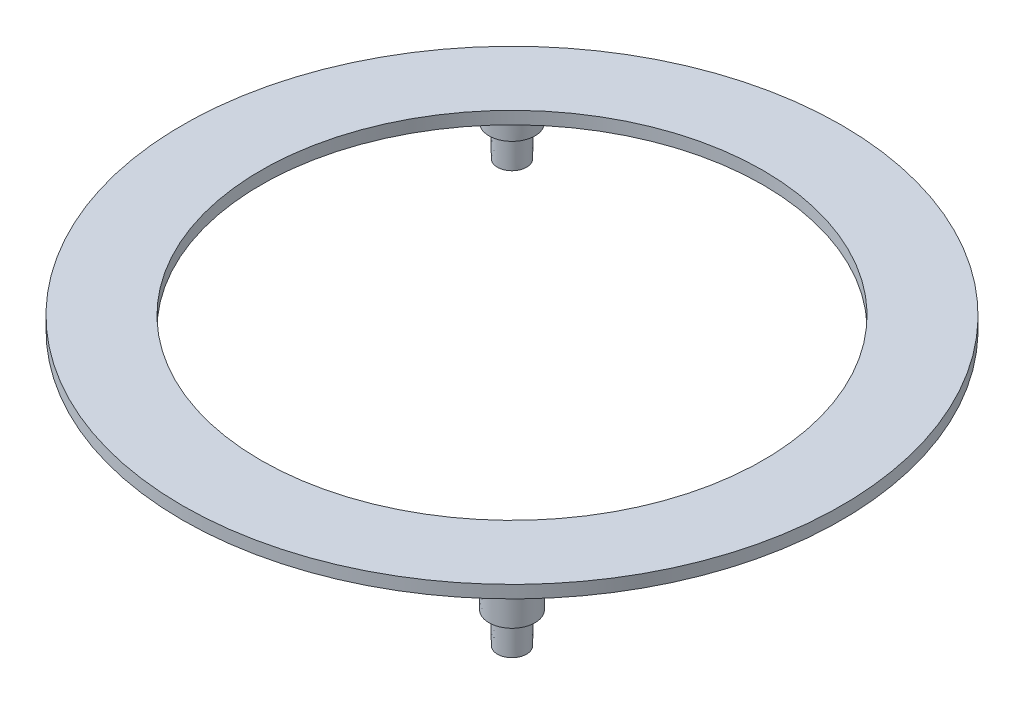
ISO-10303-21;
HEADER;
FILE_DESCRIPTION(('STEP AP214'),'2;1');
FILE_NAME('part.step','',(''),(''),'','','');
FILE_SCHEMA(('AUTOMOTIVE_DESIGN { 1 0 10303 214 1 1 1 1 }'));
ENDSEC;
DATA;
#1=APPLICATION_CONTEXT('core data for automotive mechanical design processes');
#2=APPLICATION_PROTOCOL_DEFINITION('international standard','automotive_design',2000,#1);
#3=PRODUCT_CONTEXT('',#1,'mechanical');
#4=PRODUCT('Part','Part','',(#3));
#5=PRODUCT_RELATED_PRODUCT_CATEGORY('part','',(#4));
#6=PRODUCT_DEFINITION_FORMATION('','',#4);
#7=PRODUCT_DEFINITION_CONTEXT('part definition',#1,'design');
#8=PRODUCT_DEFINITION('design','',#6,#7);
#9=PRODUCT_DEFINITION_SHAPE('','',#8);
#10=(LENGTH_UNIT() NAMED_UNIT(*) SI_UNIT(.MILLI.,.METRE.));
#11=(NAMED_UNIT(*) PLANE_ANGLE_UNIT() SI_UNIT($,.RADIAN.));
#12=(NAMED_UNIT(*) SI_UNIT($,.STERADIAN.) SOLID_ANGLE_UNIT());
#13=UNCERTAINTY_MEASURE_WITH_UNIT(LENGTH_MEASURE(1.E-05),#10,'distance_accuracy_value','');
#14=(GEOMETRIC_REPRESENTATION_CONTEXT(3) GLOBAL_UNCERTAINTY_ASSIGNED_CONTEXT((#13)) GLOBAL_UNIT_ASSIGNED_CONTEXT((#10,
#11,#12)) REPRESENTATION_CONTEXT('',''));
#15=CARTESIAN_POINT('',(0.,0.,0.));
#16=DIRECTION('',(0.,0.,1.));
#17=DIRECTION('',(1.,0.,0.));
#18=AXIS2_PLACEMENT_3D('',#15,#16,#17);
#19=CARTESIAN_POINT('',(0.,0.4,-1.53064501));
#20=DIRECTION('',(0.,1.,0.));
#21=DIRECTION('',(0.,0.,1.));
#22=AXIS2_PLACEMENT_3D('',#19,#20,#21);
#23=PLANE('',#22);
#24=CARTESIAN_POINT('',(0.,0.4,-1.53064501));
#25=DIRECTION('',(0.,1.,0.));
#26=DIRECTION('',(0.,0.,1.));
#27=AXIS2_PLACEMENT_3D('',#24,#25,#26);
#28=CIRCLE('',#27,10.5);
#29=CARTESIAN_POINT('',(0.,0.4,8.96935499));
#30=VERTEX_POINT('',#29);
#31=EDGE_CURVE('E105',#30,#30,#28,.T.);
#32=ORIENTED_EDGE('',*,*,#31,.T.);
#33=EDGE_LOOP('',(#32));
#34=FACE_BOUND('',#33,.T.);
#35=CARTESIAN_POINT('',(0.,0.4,-1.53064501));
#36=DIRECTION('',(0.,1.,0.));
#37=DIRECTION('',(0.,0.,1.));
#38=AXIS2_PLACEMENT_3D('',#35,#36,#37);
#39=CIRCLE('',#38,8.);
#40=CARTESIAN_POINT('',(0.,0.4,6.46935499));
#41=VERTEX_POINT('',#40);
#42=EDGE_CURVE('E98',#41,#41,#39,.T.);
#43=ORIENTED_EDGE('',*,*,#42,.F.);
#44=EDGE_LOOP('',(#43));
#45=FACE_BOUND('',#44,.T.);
#46=ADVANCED_FACE('F37',(#34,#45),#23,.T.);
#47=CARTESIAN_POINT('',(0.,0.,-1.53064501));
#48=DIRECTION('',(0.,1.,0.));
#49=DIRECTION('',(0.,0.,1.));
#50=AXIS2_PLACEMENT_3D('',#47,#48,#49);
#51=PLANE('',#50);
#52=CARTESIAN_POINT('',(6.71751442127212,0.,5.18686941127228));
#53=DIRECTION('',(0.,1.,0.));
#54=DIRECTION('',(1.,0.,0.));
#55=AXIS2_PLACEMENT_3D('',#52,#53,#54);
#56=CIRCLE('',#55,0.750000000000001);
#57=CARTESIAN_POINT('',(7.46751442127212,0.,5.18686941127229));
#58=VERTEX_POINT('',#57);
#59=EDGE_CURVE('E72',#58,#58,#56,.T.);
#60=ORIENTED_EDGE('',*,*,#59,.T.);
#61=EDGE_LOOP('',(#60));
#62=FACE_BOUND('',#61,.T.);
#63=CARTESIAN_POINT('',(6.71751442127221,0.,-8.24815943127219));
#64=DIRECTION('',(0.,1.,0.));
#65=DIRECTION('',(0.,0.,-1.));
#66=AXIS2_PLACEMENT_3D('',#63,#64,#65);
#67=CIRCLE('',#66,0.750000000000001);
#68=CARTESIAN_POINT('',(6.71751442127221,0.,-8.99815943127219));
#69=VERTEX_POINT('',#68);
#70=EDGE_CURVE('E62',#69,#69,#67,.T.);
#71=ORIENTED_EDGE('',*,*,#70,.T.);
#72=EDGE_LOOP('',(#71));
#73=FACE_BOUND('',#72,.T.);
#74=CARTESIAN_POINT('',(-6.71751442127217,0.,-8.24815943127224));
#75=DIRECTION('',(0.,1.,0.));
#76=DIRECTION('',(-1.,0.,0.));
#77=AXIS2_PLACEMENT_3D('',#74,#75,#76);
#78=CIRCLE('',#77,0.750000000000001);
#79=CARTESIAN_POINT('',(-7.46751442127217,0.,-8.24815943127224));
#80=VERTEX_POINT('',#79);
#81=EDGE_CURVE('E61',#80,#80,#78,.T.);
#82=ORIENTED_EDGE('',*,*,#81,.T.);
#83=EDGE_LOOP('',(#82));
#84=FACE_BOUND('',#83,.T.);
#85=CARTESIAN_POINT('',(-6.71751442127221,0.,5.18686941127219));
#86=DIRECTION('',(0.,1.,0.));
#87=DIRECTION('',(0.,0.,1.));
#88=AXIS2_PLACEMENT_3D('',#85,#86,#87);
#89=CIRCLE('',#88,0.750000000000001);
#90=CARTESIAN_POINT('',(-6.71751442127221,0.,5.93686941127219));
#91=VERTEX_POINT('',#90);
#92=EDGE_CURVE('E88',#91,#91,#89,.T.);
#93=ORIENTED_EDGE('',*,*,#92,.T.);
#94=EDGE_LOOP('',(#93));
#95=FACE_BOUND('',#94,.T.);
#96=CARTESIAN_POINT('',(0.,0.,-1.53064501));
#97=DIRECTION('',(0.,1.,0.));
#98=DIRECTION('',(0.,0.,1.));
#99=AXIS2_PLACEMENT_3D('',#96,#97,#98);
#100=CIRCLE('',#99,10.5);
#101=CARTESIAN_POINT('',(0.,0.,8.96935499));
#102=VERTEX_POINT('',#101);
#103=EDGE_CURVE('E101',#102,#102,#100,.T.);
#104=ORIENTED_EDGE('',*,*,#103,.F.);
#105=EDGE_LOOP('',(#104));
#106=FACE_BOUND('',#105,.T.);
#107=CARTESIAN_POINT('',(0.,0.,-1.53064501));
#108=DIRECTION('',(0.,1.,0.));
#109=DIRECTION('',(0.,0.,1.));
#110=AXIS2_PLACEMENT_3D('',#107,#108,#109);
#111=CIRCLE('',#110,8.);
#112=CARTESIAN_POINT('',(0.,0.,6.46935499));
#113=VERTEX_POINT('',#112);
#114=EDGE_CURVE('E102',#113,#113,#111,.T.);
#115=ORIENTED_EDGE('',*,*,#114,.T.);
#116=EDGE_LOOP('',(#115));
#117=FACE_BOUND('',#116,.T.);
#118=ADVANCED_FACE('F128',(#62,#73,#84,#95,#106,#117),#51,.F.);
#119=CARTESIAN_POINT('',(0.,0.4,-1.53064501));
#120=DIRECTION('',(0.,-1.,0.));
#121=DIRECTION('',(0.,0.,-1.));
#122=AXIS2_PLACEMENT_3D('',#119,#120,#121);
#123=CYLINDRICAL_SURFACE('',#122,10.5);
#124=ORIENTED_EDGE('',*,*,#31,.F.);
#125=EDGE_LOOP('',(#124));
#126=FACE_BOUND('',#125,.T.);
#127=ORIENTED_EDGE('',*,*,#103,.T.);
#128=EDGE_LOOP('',(#127));
#129=FACE_BOUND('',#128,.T.);
#130=ADVANCED_FACE('F131',(#126,#129),#123,.T.);
#131=CARTESIAN_POINT('',(0.,0.4,-1.53064501));
#132=DIRECTION('',(0.,-1.,0.));
#133=DIRECTION('',(0.,0.,-1.));
#134=AXIS2_PLACEMENT_3D('',#131,#132,#133);
#135=CYLINDRICAL_SURFACE('',#134,8.);
#136=ORIENTED_EDGE('',*,*,#42,.T.);
#137=EDGE_LOOP('',(#136));
#138=FACE_BOUND('',#137,.T.);
#139=ORIENTED_EDGE('',*,*,#114,.F.);
#140=EDGE_LOOP('',(#139));
#141=FACE_BOUND('',#140,.T.);
#142=ADVANCED_FACE('F125',(#138,#141),#135,.F.);
#143=CARTESIAN_POINT('',(-6.71751442127221,0.,5.18686941127219));
#144=DIRECTION('',(0.,1.,0.));
#145=DIRECTION('',(0.,0.,-1.));
#146=AXIS2_PLACEMENT_3D('',#143,#144,#145);
#147=CONICAL_SURFACE('',#146,0.750000000000001,0.0174532925199433);
#148=CARTESIAN_POINT('',(-6.71751442127221,-1.,5.18686941127219));
#149=DIRECTION('',(0.,1.,0.));
#150=DIRECTION('',(0.,0.,1.));
#151=AXIS2_PLACEMENT_3D('',#148,#149,#150);
#152=CIRCLE('',#151,0.732544935071784);
#153=CARTESIAN_POINT('',(-6.71751442127221,-1.,5.91941434634397));
#154=VERTEX_POINT('',#153);
#155=EDGE_CURVE('E80',#154,#154,#152,.T.);
#156=ORIENTED_EDGE('',*,*,#155,.T.);
#157=EDGE_LOOP('',(#156));
#158=FACE_BOUND('',#157,.T.);
#159=ORIENTED_EDGE('',*,*,#92,.F.);
#160=EDGE_LOOP('',(#159));
#161=FACE_BOUND('',#160,.T.);
#162=ADVANCED_FACE('F118',(#158,#161),#147,.T.);
#163=CARTESIAN_POINT('',(-6.71751442127221,-1.,5.18686941127219));
#164=DIRECTION('',(0.,1.,0.));
#165=DIRECTION('',(0.,0.,1.));
#166=AXIS2_PLACEMENT_3D('',#163,#164,#165);
#167=PLANE('',#166);
#168=CARTESIAN_POINT('',(-6.71751442127221,-1.,5.18686941127219));
#169=DIRECTION('',(0.,1.,0.));
#170=DIRECTION('',(0.,0.,1.));
#171=AXIS2_PLACEMENT_3D('',#168,#169,#170);
#172=CIRCLE('',#171,0.482544935071784);
#173=CARTESIAN_POINT('',(-6.71751442127221,-1.,5.66941434634397));
#174=VERTEX_POINT('',#173);
#175=EDGE_CURVE('E53',#174,#174,#172,.F.);
#176=ORIENTED_EDGE('',*,*,#175,.F.);
#177=EDGE_LOOP('',(#176));
#178=FACE_BOUND('',#177,.T.);
#179=ORIENTED_EDGE('',*,*,#155,.F.);
#180=EDGE_LOOP('',(#179));
#181=FACE_BOUND('',#180,.T.);
#182=ADVANCED_FACE('F115',(#178,#181),#167,.F.);
#183=CARTESIAN_POINT('',(-6.71751442127221,0.,5.18686941127219));
#184=DIRECTION('',(0.,1.,0.));
#185=DIRECTION('',(0.,0.,-1.));
#186=AXIS2_PLACEMENT_3D('',#183,#184,#185);
#187=CONICAL_SURFACE('',#186,0.500000000000002,0.0174532925199433);
#188=CARTESIAN_POINT('',(-6.71751442127221,-2.,5.18686941127219));
#189=DIRECTION('',(0.,-1.,0.));
#190=DIRECTION('',(0.,0.,-1.));
#191=AXIS2_PLACEMENT_3D('',#188,#189,#190);
#192=CIRCLE('',#191,0.465089870143566);
#193=CARTESIAN_POINT('',(-6.71751442127221,-2.,4.72177954112862));
#194=VERTEX_POINT('',#193);
#195=EDGE_CURVE('E84',#194,#194,#192,.T.);
#196=ORIENTED_EDGE('',*,*,#195,.F.);
#197=EDGE_LOOP('',(#196));
#198=FACE_BOUND('',#197,.T.);
#199=ORIENTED_EDGE('',*,*,#175,.T.);
#200=EDGE_LOOP('',(#199));
#201=FACE_BOUND('',#200,.T.);
#202=ADVANCED_FACE('F39',(#198,#201),#187,.T.);
#203=CARTESIAN_POINT('',(-6.71751442127221,-2.,5.18686941127219));
#204=DIRECTION('',(0.,-1.,0.));
#205=DIRECTION('',(0.,0.,-1.));
#206=AXIS2_PLACEMENT_3D('',#203,#204,#205);
#207=PLANE('',#206);
#208=ORIENTED_EDGE('',*,*,#195,.T.);
#209=EDGE_LOOP('',(#208));
#210=FACE_BOUND('',#209,.T.);
#211=ADVANCED_FACE('F178',(#210),#207,.T.);
#212=CARTESIAN_POINT('',(-6.71751442127217,0.,-8.24815943127224));
#213=DIRECTION('',(0.,1.,0.));
#214=DIRECTION('',(0.,0.,-1.));
#215=AXIS2_PLACEMENT_3D('',#212,#213,#214);
#216=CONICAL_SURFACE('',#215,0.750000000000001,0.0174532925199433);
#217=CARTESIAN_POINT('',(-6.71751442127217,-1.,-8.24815943127224));
#218=DIRECTION('',(0.,1.,0.));
#219=DIRECTION('',(0.,0.,1.));
#220=AXIS2_PLACEMENT_3D('',#217,#218,#219);
#221=CIRCLE('',#220,0.732544935071784);
#222=CARTESIAN_POINT('',(-6.71751442127217,-1.,-7.51561449620045));
#223=VERTEX_POINT('',#222);
#224=EDGE_CURVE('E82',#223,#223,#221,.T.);
#225=ORIENTED_EDGE('',*,*,#224,.T.);
#226=EDGE_LOOP('',(#225));
#227=FACE_BOUND('',#226,.T.);
#228=ORIENTED_EDGE('',*,*,#81,.F.);
#229=EDGE_LOOP('',(#228));
#230=FACE_BOUND('',#229,.T.);
#231=ADVANCED_FACE('F175',(#227,#230),#216,.T.);
#232=CARTESIAN_POINT('',(-6.71751442127217,-1.,-8.24815943127224));
#233=DIRECTION('',(0.,1.,0.));
#234=DIRECTION('',(-1.,0.,0.));
#235=AXIS2_PLACEMENT_3D('',#232,#233,#234);
#236=PLANE('',#235);
#237=CARTESIAN_POINT('',(-6.71751442127217,-1.,-8.24815943127224));
#238=DIRECTION('',(0.,1.,0.));
#239=DIRECTION('',(0.,0.,1.));
#240=AXIS2_PLACEMENT_3D('',#237,#238,#239);
#241=CIRCLE('',#240,0.482544935071784);
#242=CARTESIAN_POINT('',(-6.71751442127217,-1.,-7.76561449620045));
#243=VERTEX_POINT('',#242);
#244=EDGE_CURVE('E48',#243,#243,#241,.F.);
#245=ORIENTED_EDGE('',*,*,#244,.F.);
#246=EDGE_LOOP('',(#245));
#247=FACE_BOUND('',#246,.T.);
#248=ORIENTED_EDGE('',*,*,#224,.F.);
#249=EDGE_LOOP('',(#248));
#250=FACE_BOUND('',#249,.T.);
#251=ADVANCED_FACE('F168',(#247,#250),#236,.F.);
#252=CARTESIAN_POINT('',(6.71751442127221,0.,-8.24815943127219));
#253=DIRECTION('',(0.,1.,0.));
#254=DIRECTION('',(0.,0.,-1.));
#255=AXIS2_PLACEMENT_3D('',#252,#253,#254);
#256=CONICAL_SURFACE('',#255,0.750000000000001,0.0174532925199433);
#257=CARTESIAN_POINT('',(6.71751442127221,-1.,-8.24815943127219));
#258=DIRECTION('',(0.,1.,0.));
#259=DIRECTION('',(0.,0.,1.));
#260=AXIS2_PLACEMENT_3D('',#257,#258,#259);
#261=CIRCLE('',#260,0.732544935071784);
#262=CARTESIAN_POINT('',(6.71751442127221,-1.,-7.51561449620041));
#263=VERTEX_POINT('',#262);
#264=EDGE_CURVE('E59',#263,#263,#261,.T.);
#265=ORIENTED_EDGE('',*,*,#264,.T.);
#266=EDGE_LOOP('',(#265));
#267=FACE_BOUND('',#266,.T.);
#268=ORIENTED_EDGE('',*,*,#70,.F.);
#269=EDGE_LOOP('',(#268));
#270=FACE_BOUND('',#269,.T.);
#271=ADVANCED_FACE('F165',(#267,#270),#256,.T.);
#272=CARTESIAN_POINT('',(6.71751442127221,-1.,-8.24815943127219));
#273=DIRECTION('',(0.,1.,0.));
#274=DIRECTION('',(0.,0.,-1.));
#275=AXIS2_PLACEMENT_3D('',#272,#273,#274);
#276=PLANE('',#275);
#277=CARTESIAN_POINT('',(6.71751442127221,-1.,-8.24815943127219));
#278=DIRECTION('',(0.,1.,0.));
#279=DIRECTION('',(0.,0.,1.));
#280=AXIS2_PLACEMENT_3D('',#277,#278,#279);
#281=CIRCLE('',#280,0.482544935071784);
#282=CARTESIAN_POINT('',(6.71751442127221,-1.,-7.76561449620041));
#283=VERTEX_POINT('',#282);
#284=EDGE_CURVE('E44',#283,#283,#281,.F.);
#285=ORIENTED_EDGE('',*,*,#284,.F.);
#286=EDGE_LOOP('',(#285));
#287=FACE_BOUND('',#286,.T.);
#288=ORIENTED_EDGE('',*,*,#264,.F.);
#289=EDGE_LOOP('',(#288));
#290=FACE_BOUND('',#289,.T.);
#291=ADVANCED_FACE('F157',(#287,#290),#276,.F.);
#292=CARTESIAN_POINT('',(6.71751442127212,0.,5.18686941127228));
#293=DIRECTION('',(0.,1.,0.));
#294=DIRECTION('',(0.,0.,-1.));
#295=AXIS2_PLACEMENT_3D('',#292,#293,#294);
#296=CONICAL_SURFACE('',#295,0.750000000000001,0.0174532925199433);
#297=CARTESIAN_POINT('',(6.71751442127212,-1.,5.18686941127228));
#298=DIRECTION('',(0.,1.,0.));
#299=DIRECTION('',(0.,0.,1.));
#300=AXIS2_PLACEMENT_3D('',#297,#298,#299);
#301=CIRCLE('',#300,0.732544935071784);
#302=CARTESIAN_POINT('',(6.71751442127212,-1.,5.91941434634407));
#303=VERTEX_POINT('',#302);
#304=EDGE_CURVE('E77',#303,#303,#301,.T.);
#305=ORIENTED_EDGE('',*,*,#304,.T.);
#306=EDGE_LOOP('',(#305));
#307=FACE_BOUND('',#306,.T.);
#308=ORIENTED_EDGE('',*,*,#59,.F.);
#309=EDGE_LOOP('',(#308));
#310=FACE_BOUND('',#309,.T.);
#311=ADVANCED_FACE('F153',(#307,#310),#296,.T.);
#312=CARTESIAN_POINT('',(6.71751442127212,-1.,5.18686941127228));
#313=DIRECTION('',(0.,1.,0.));
#314=DIRECTION('',(1.,0.,0.));
#315=AXIS2_PLACEMENT_3D('',#312,#313,#314);
#316=PLANE('',#315);
#317=CARTESIAN_POINT('',(6.71751442127212,-1.,5.18686941127228));
#318=DIRECTION('',(0.,1.,0.));
#319=DIRECTION('',(0.,0.,1.));
#320=AXIS2_PLACEMENT_3D('',#317,#318,#319);
#321=CIRCLE('',#320,0.482544935071784);
#322=CARTESIAN_POINT('',(6.71751442127212,-1.,5.66941434634407));
#323=VERTEX_POINT('',#322);
#324=EDGE_CURVE('E10',#323,#323,#321,.F.);
#325=ORIENTED_EDGE('',*,*,#324,.F.);
#326=EDGE_LOOP('',(#325));
#327=FACE_BOUND('',#326,.T.);
#328=ORIENTED_EDGE('',*,*,#304,.F.);
#329=EDGE_LOOP('',(#328));
#330=FACE_BOUND('',#329,.T.);
#331=ADVANCED_FACE('F156',(#327,#330),#316,.F.);
#332=CARTESIAN_POINT('',(-6.71751442127217,0.,-8.24815943127224));
#333=DIRECTION('',(0.,1.,0.));
#334=DIRECTION('',(0.,0.,-1.));
#335=AXIS2_PLACEMENT_3D('',#332,#333,#334);
#336=CONICAL_SURFACE('',#335,0.500000000000002,0.0174532925199433);
#337=CARTESIAN_POINT('',(-6.71751442127217,-2.,-8.24815943127224));
#338=DIRECTION('',(0.,-1.,0.));
#339=DIRECTION('',(0.,0.,-1.));
#340=AXIS2_PLACEMENT_3D('',#337,#338,#339);
#341=CIRCLE('',#340,0.465089870143566);
#342=CARTESIAN_POINT('',(-6.71751442127217,-2.,-8.7132493014158));
#343=VERTEX_POINT('',#342);
#344=EDGE_CURVE('E68',#343,#343,#341,.T.);
#345=ORIENTED_EDGE('',*,*,#344,.F.);
#346=EDGE_LOOP('',(#345));
#347=FACE_BOUND('',#346,.T.);
#348=ORIENTED_EDGE('',*,*,#244,.T.);
#349=EDGE_LOOP('',(#348));
#350=FACE_BOUND('',#349,.T.);
#351=ADVANCED_FACE('F179',(#347,#350),#336,.T.);
#352=CARTESIAN_POINT('',(-6.71751442127217,-2.,-8.24815943127224));
#353=DIRECTION('',(0.,-1.,0.));
#354=DIRECTION('',(1.,0.,0.));
#355=AXIS2_PLACEMENT_3D('',#352,#353,#354);
#356=PLANE('',#355);
#357=ORIENTED_EDGE('',*,*,#344,.T.);
#358=EDGE_LOOP('',(#357));
#359=FACE_BOUND('',#358,.T.);
#360=ADVANCED_FACE('F173',(#359),#356,.T.);
#361=CARTESIAN_POINT('',(6.71751442127221,0.,-8.24815943127219));
#362=DIRECTION('',(0.,1.,0.));
#363=DIRECTION('',(0.,0.,-1.));
#364=AXIS2_PLACEMENT_3D('',#361,#362,#363);
#365=CONICAL_SURFACE('',#364,0.500000000000002,0.0174532925199433);
#366=CARTESIAN_POINT('',(6.71751442127221,-2.,-8.24815943127219));
#367=DIRECTION('',(0.,-1.,0.));
#368=DIRECTION('',(0.,0.,-1.));
#369=AXIS2_PLACEMENT_3D('',#366,#367,#368);
#370=CIRCLE('',#369,0.465089870143566);
#371=CARTESIAN_POINT('',(6.71751442127221,-2.,-8.71324930141576));
#372=VERTEX_POINT('',#371);
#373=EDGE_CURVE('E57',#372,#372,#370,.T.);
#374=ORIENTED_EDGE('',*,*,#373,.F.);
#375=EDGE_LOOP('',(#374));
#376=FACE_BOUND('',#375,.T.);
#377=ORIENTED_EDGE('',*,*,#284,.T.);
#378=EDGE_LOOP('',(#377));
#379=FACE_BOUND('',#378,.T.);
#380=ADVANCED_FACE('F170',(#376,#379),#365,.T.);
#381=CARTESIAN_POINT('',(6.71751442127221,-2.,-8.24815943127219));
#382=DIRECTION('',(0.,-1.,0.));
#383=DIRECTION('',(0.,0.,1.));
#384=AXIS2_PLACEMENT_3D('',#381,#382,#383);
#385=PLANE('',#384);
#386=ORIENTED_EDGE('',*,*,#373,.T.);
#387=EDGE_LOOP('',(#386));
#388=FACE_BOUND('',#387,.T.);
#389=ADVANCED_FACE('F163',(#388),#385,.T.);
#390=CARTESIAN_POINT('',(6.71751442127212,0.,5.18686941127228));
#391=DIRECTION('',(0.,1.,0.));
#392=DIRECTION('',(0.,0.,-1.));
#393=AXIS2_PLACEMENT_3D('',#390,#391,#392);
#394=CONICAL_SURFACE('',#393,0.500000000000002,0.0174532925199433);
#395=CARTESIAN_POINT('',(6.71751442127212,-2.,5.18686941127228));
#396=DIRECTION('',(0.,-1.,0.));
#397=DIRECTION('',(0.,0.,-1.));
#398=AXIS2_PLACEMENT_3D('',#395,#396,#397);
#399=CIRCLE('',#398,0.465089870143566);
#400=CARTESIAN_POINT('',(6.71751442127212,-2.,4.72177954112872));
#401=VERTEX_POINT('',#400);
#402=EDGE_CURVE('E63',#401,#401,#399,.T.);
#403=ORIENTED_EDGE('',*,*,#402,.F.);
#404=EDGE_LOOP('',(#403));
#405=FACE_BOUND('',#404,.T.);
#406=ORIENTED_EDGE('',*,*,#324,.T.);
#407=EDGE_LOOP('',(#406));
#408=FACE_BOUND('',#407,.T.);
#409=ADVANCED_FACE('F159',(#405,#408),#394,.T.);
#410=CARTESIAN_POINT('',(6.71751442127212,-2.,5.18686941127228));
#411=DIRECTION('',(0.,-1.,0.));
#412=DIRECTION('',(-1.,0.,0.));
#413=AXIS2_PLACEMENT_3D('',#410,#411,#412);
#414=PLANE('',#413);
#415=ORIENTED_EDGE('',*,*,#402,.T.);
#416=EDGE_LOOP('',(#415));
#417=FACE_BOUND('',#416,.T.);
#418=ADVANCED_FACE('F162',(#417),#414,.T.);
#419=CLOSED_SHELL('',(#46,#118,#130,#142,#162,#182,#202,#211,#231,#251,#271,#291,#311,#331,#351,
#360,#380,#389,#409,#418));
#420=MANIFOLD_SOLID_BREP('B2',#419);
#421=ADVANCED_BREP_SHAPE_REPRESENTATION('',(#18,#420),#14);
#422=SHAPE_DEFINITION_REPRESENTATION(#9,#421);
ENDSEC;
END-ISO-10303-21;
